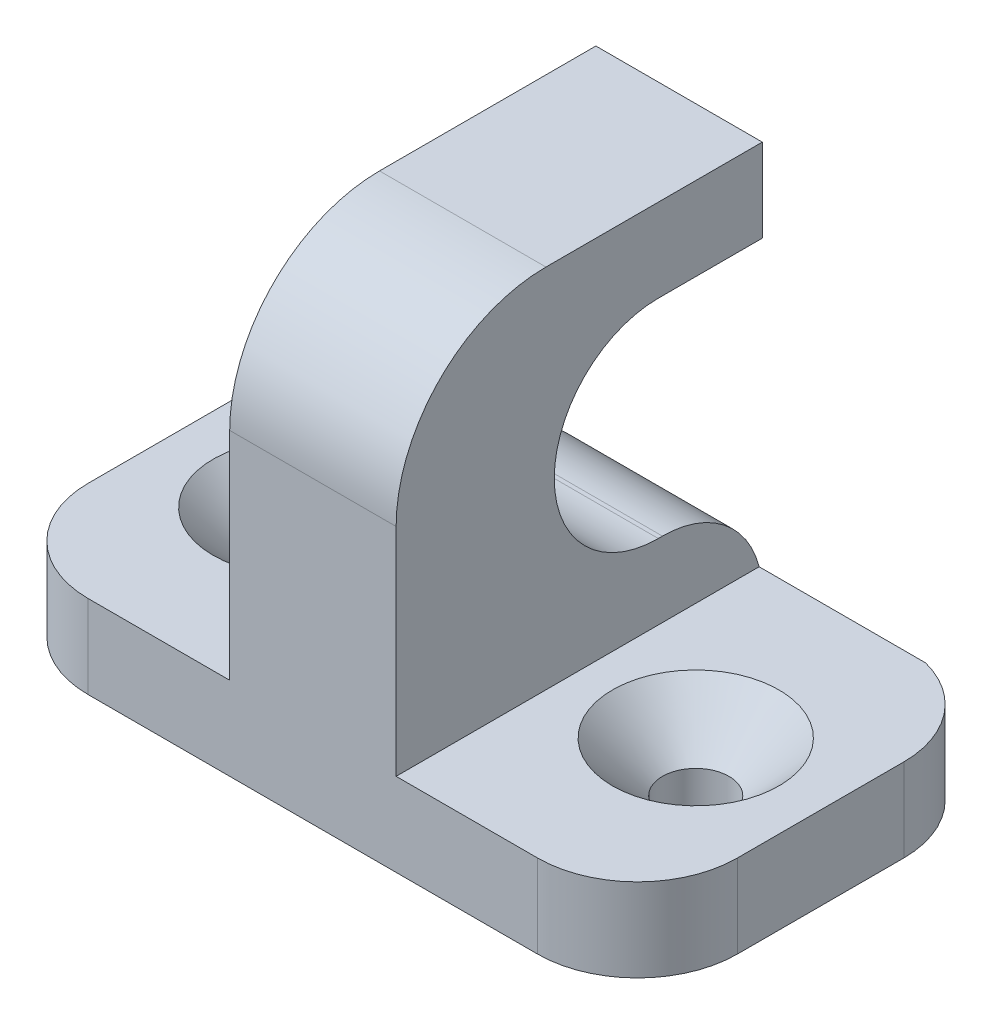
ISO-10303-21;
HEADER;
FILE_DESCRIPTION(('STEP AP214'),'2;1');
FILE_NAME('part.step','',(''),(''),'','','');
FILE_SCHEMA(('AUTOMOTIVE_DESIGN { 1 0 10303 214 1 1 1 1 }'));
ENDSEC;
DATA;
#1=APPLICATION_CONTEXT('core data for automotive mechanical design processes');
#2=APPLICATION_PROTOCOL_DEFINITION('international standard','automotive_design',2000,#1);
#3=PRODUCT_CONTEXT('',#1,'mechanical');
#4=PRODUCT('Part','Part','',(#3));
#5=PRODUCT_RELATED_PRODUCT_CATEGORY('part','',(#4));
#6=PRODUCT_DEFINITION_FORMATION('','',#4);
#7=PRODUCT_DEFINITION_CONTEXT('part definition',#1,'design');
#8=PRODUCT_DEFINITION('design','',#6,#7);
#9=PRODUCT_DEFINITION_SHAPE('','',#8);
#10=(LENGTH_UNIT() NAMED_UNIT(*) SI_UNIT(.MILLI.,.METRE.));
#11=(NAMED_UNIT(*) PLANE_ANGLE_UNIT() SI_UNIT($,.RADIAN.));
#12=(NAMED_UNIT(*) SI_UNIT($,.STERADIAN.) SOLID_ANGLE_UNIT());
#13=UNCERTAINTY_MEASURE_WITH_UNIT(LENGTH_MEASURE(1.E-05),#10,'distance_accuracy_value','');
#14=(GEOMETRIC_REPRESENTATION_CONTEXT(3) GLOBAL_UNCERTAINTY_ASSIGNED_CONTEXT((#13)) GLOBAL_UNIT_ASSIGNED_CONTEXT((#10,
#11,#12)) REPRESENTATION_CONTEXT('',''));
#15=CARTESIAN_POINT('',(0.,0.,0.));
#16=DIRECTION('',(0.,0.,1.));
#17=DIRECTION('',(1.,0.,0.));
#18=AXIS2_PLACEMENT_3D('',#15,#16,#17);
#19=CARTESIAN_POINT('',(-19.5,5.,-11.));
#20=DIRECTION('',(0.,0.,-1.));
#21=DIRECTION('',(-1.,0.,0.));
#22=AXIS2_PLACEMENT_3D('',#19,#20,#21);
#23=PLANE('',#22);
#24=DIRECTION('',(1.,0.,0.));
#25=VECTOR('',#24,1.);
#26=CARTESIAN_POINT('',(5.,22.,-11.));
#27=LINE('',#26,#25);
#28=CARTESIAN_POINT('',(-5.,22.,-11.));
#29=VERTEX_POINT('',#28);
#30=CARTESIAN_POINT('',(5.,22.,-11.));
#31=VERTEX_POINT('',#30);
#32=EDGE_CURVE('E182',#29,#31,#27,.T.);
#33=ORIENTED_EDGE('',*,*,#32,.F.);
#34=DIRECTION('',(0.,-1.,0.));
#35=VECTOR('',#34,1.);
#36=CARTESIAN_POINT('',(-5.,27.,-11.));
#37=LINE('',#36,#35);
#38=CARTESIAN_POINT('',(-5.,27.,-11.));
#39=VERTEX_POINT('',#38);
#40=EDGE_CURVE('E195',#39,#29,#37,.T.);
#41=ORIENTED_EDGE('',*,*,#40,.F.);
#42=DIRECTION('',(-1.,0.,0.));
#43=VECTOR('',#42,1.);
#44=CARTESIAN_POINT('',(-5.,27.,-11.));
#45=LINE('',#44,#43);
#46=CARTESIAN_POINT('',(5.,27.,-11.));
#47=VERTEX_POINT('',#46);
#48=EDGE_CURVE('E430',#47,#39,#45,.T.);
#49=ORIENTED_EDGE('',*,*,#48,.F.);
#50=DIRECTION('',(0.,-1.,0.));
#51=VECTOR('',#50,1.);
#52=CARTESIAN_POINT('',(5.,27.,-11.));
#53=LINE('',#52,#51);
#54=EDGE_CURVE('E198',#47,#31,#53,.T.);
#55=ORIENTED_EDGE('',*,*,#54,.T.);
#56=EDGE_LOOP('',(#33,#41,#49,#55));
#57=FACE_BOUND('',#56,.T.);
#58=ADVANCED_FACE('F41',(#57),#23,.T.);
#59=CARTESIAN_POINT('',(0.,5.,0.));
#60=DIRECTION('',(0.,1.,0.));
#61=DIRECTION('',(0.,0.,1.));
#62=AXIS2_PLACEMENT_3D('',#59,#60,#61);
#63=PLANE('',#62);
#64=CARTESIAN_POINT('',(12.,5.,0.));
#65=DIRECTION('',(0.,1.,0.));
#66=DIRECTION('',(0.,0.,1.));
#67=AXIS2_PLACEMENT_3D('',#64,#65,#66);
#68=CIRCLE('',#67,5.00000000000001);
#69=CARTESIAN_POINT('',(12.,5.,5.00000000000001));
#70=VERTEX_POINT('',#69);
#71=EDGE_CURVE('E360',#70,#70,#68,.F.);
#72=ORIENTED_EDGE('',*,*,#71,.T.);
#73=EDGE_LOOP('',(#72));
#74=FACE_BOUND('',#73,.T.);
#75=CARTESIAN_POINT('',(13.5,5.,-5.));
#76=DIRECTION('',(0.,1.,0.));
#77=DIRECTION('',(0.,0.,1.));
#78=AXIS2_PLACEMENT_3D('',#75,#76,#77);
#79=CIRCLE('',#78,6.);
#80=CARTESIAN_POINT('',(19.5,5.,-5.));
#81=VERTEX_POINT('',#80);
#82=CARTESIAN_POINT('',(15.,5.,-10.8094750193111));
#83=VERTEX_POINT('',#82);
#84=EDGE_CURVE('E307',#81,#83,#79,.T.);
#85=ORIENTED_EDGE('',*,*,#84,.T.);
#86=DIRECTION('',(1.,0.,0.));
#87=VECTOR('',#86,1.);
#88=CARTESIAN_POINT('',(15.,5.,-10.8094750193111));
#89=LINE('',#88,#87);
#90=CARTESIAN_POINT('',(5.,5.,-10.8094750193111));
#91=VERTEX_POINT('',#90);
#92=EDGE_CURVE('E58',#83,#91,#89,.F.);
#93=ORIENTED_EDGE('',*,*,#92,.T.);
#94=DIRECTION('',(0.,0.,-1.));
#95=VECTOR('',#94,1.);
#96=CARTESIAN_POINT('',(5.,5.,-11.));
#97=LINE('',#96,#95);
#98=CARTESIAN_POINT('',(5.,5.,11.));
#99=VERTEX_POINT('',#98);
#100=EDGE_CURVE('E417',#99,#91,#97,.T.);
#101=ORIENTED_EDGE('',*,*,#100,.F.);
#102=DIRECTION('',(1.,0.,0.));
#103=VECTOR('',#102,1.);
#104=CARTESIAN_POINT('',(-19.5,5.,11.));
#105=LINE('',#104,#103);
#106=CARTESIAN_POINT('',(13.5,5.,11.));
#107=VERTEX_POINT('',#106);
#108=EDGE_CURVE('E223',#99,#107,#105,.T.);
#109=ORIENTED_EDGE('',*,*,#108,.T.);
#110=CARTESIAN_POINT('',(13.5,5.,5.));
#111=DIRECTION('',(0.,1.,0.));
#112=DIRECTION('',(0.,0.,1.));
#113=AXIS2_PLACEMENT_3D('',#110,#111,#112);
#114=CIRCLE('',#113,6.);
#115=CARTESIAN_POINT('',(19.5,5.,5.));
#116=VERTEX_POINT('',#115);
#117=EDGE_CURVE('E310',#107,#116,#114,.T.);
#118=ORIENTED_EDGE('',*,*,#117,.T.);
#119=DIRECTION('',(0.,0.,1.));
#120=VECTOR('',#119,1.);
#121=CARTESIAN_POINT('',(19.5,5.,-11.));
#122=LINE('',#121,#120);
#123=EDGE_CURVE('E229',#81,#116,#122,.T.);
#124=ORIENTED_EDGE('',*,*,#123,.F.);
#125=EDGE_LOOP('',(#85,#93,#101,#109,#118,#124));
#126=FACE_BOUND('',#125,.T.);
#127=ADVANCED_FACE('F380',(#74,#126),#63,.T.);
#128=CARTESIAN_POINT('',(-19.5,5.,-11.));
#129=DIRECTION('',(1.,0.,0.));
#130=DIRECTION('',(0.,0.,-1.));
#131=AXIS2_PLACEMENT_3D('',#128,#129,#130);
#132=PLANE('',#131);
#133=DIRECTION('',(0.,0.,1.));
#134=VECTOR('',#133,1.);
#135=CARTESIAN_POINT('',(-19.5,0.,-11.));
#136=LINE('',#135,#134);
#137=CARTESIAN_POINT('',(-19.5,0.,-5.));
#138=VERTEX_POINT('',#137);
#139=CARTESIAN_POINT('',(-19.5,0.,5.));
#140=VERTEX_POINT('',#139);
#141=EDGE_CURVE('E212',#138,#140,#136,.T.);
#142=ORIENTED_EDGE('',*,*,#141,.T.);
#143=DIRECTION('',(0.,-1.,0.));
#144=VECTOR('',#143,1.);
#145=CARTESIAN_POINT('',(-19.5,5.,5.));
#146=LINE('',#145,#144);
#147=CARTESIAN_POINT('',(-19.5,5.,5.));
#148=VERTEX_POINT('',#147);
#149=EDGE_CURVE('E291',#140,#148,#146,.F.);
#150=ORIENTED_EDGE('',*,*,#149,.T.);
#151=DIRECTION('',(0.,0.,1.));
#152=VECTOR('',#151,1.);
#153=CARTESIAN_POINT('',(-19.5,5.,-11.));
#154=LINE('',#153,#152);
#155=CARTESIAN_POINT('',(-19.5,5.,-5.));
#156=VERTEX_POINT('',#155);
#157=EDGE_CURVE('E219',#156,#148,#154,.T.);
#158=ORIENTED_EDGE('',*,*,#157,.F.);
#159=DIRECTION('',(0.,-1.,0.));
#160=VECTOR('',#159,1.);
#161=CARTESIAN_POINT('',(-19.5,0.,-5.));
#162=LINE('',#161,#160);
#163=EDGE_CURVE('E287',#156,#138,#162,.T.);
#164=ORIENTED_EDGE('',*,*,#163,.T.);
#165=EDGE_LOOP('',(#142,#150,#158,#164));
#166=FACE_BOUND('',#165,.T.);
#167=ADVANCED_FACE('F386',(#166),#132,.F.);
#168=CARTESIAN_POINT('',(-19.5,5.,11.));
#169=DIRECTION('',(0.,0.,-1.));
#170=DIRECTION('',(-1.,0.,0.));
#171=AXIS2_PLACEMENT_3D('',#168,#169,#170);
#172=PLANE('',#171);
#173=DIRECTION('',(0.,-1.,0.));
#174=VECTOR('',#173,1.);
#175=CARTESIAN_POINT('',(5.,27.,11.));
#176=LINE('',#175,#174);
#177=CARTESIAN_POINT('',(5.,18.,11.));
#178=VERTEX_POINT('',#177);
#179=EDGE_CURVE('E215',#178,#99,#176,.T.);
#180=ORIENTED_EDGE('',*,*,#179,.F.);
#181=DIRECTION('',(1.,0.,0.));
#182=VECTOR('',#181,1.);
#183=CARTESIAN_POINT('',(-5.,18.,11.));
#184=LINE('',#183,#182);
#185=CARTESIAN_POINT('',(-5.,18.,11.));
#186=VERTEX_POINT('',#185);
#187=EDGE_CURVE('E327',#178,#186,#184,.F.);
#188=ORIENTED_EDGE('',*,*,#187,.T.);
#189=DIRECTION('',(0.,-1.,0.));
#190=VECTOR('',#189,1.);
#191=CARTESIAN_POINT('',(-5.,27.,11.));
#192=LINE('',#191,#190);
#193=CARTESIAN_POINT('',(-5.,5.,11.));
#194=VERTEX_POINT('',#193);
#195=EDGE_CURVE('E208',#186,#194,#192,.T.);
#196=ORIENTED_EDGE('',*,*,#195,.T.);
#197=CARTESIAN_POINT('',(-13.5,5.,11.));
#198=VERTEX_POINT('',#197);
#199=EDGE_CURVE('E225',#198,#194,#105,.T.);
#200=ORIENTED_EDGE('',*,*,#199,.F.);
#201=DIRECTION('',(0.,-1.,0.));
#202=VECTOR('',#201,1.);
#203=CARTESIAN_POINT('',(-13.5,5.,11.));
#204=LINE('',#203,#202);
#205=CARTESIAN_POINT('',(-13.5,0.,11.));
#206=VERTEX_POINT('',#205);
#207=EDGE_CURVE('E271',#198,#206,#204,.T.);
#208=ORIENTED_EDGE('',*,*,#207,.T.);
#209=DIRECTION('',(1.,0.,0.));
#210=VECTOR('',#209,1.);
#211=CARTESIAN_POINT('',(-19.5,0.,11.));
#212=LINE('',#211,#210);
#213=CARTESIAN_POINT('',(13.5,0.,11.));
#214=VERTEX_POINT('',#213);
#215=EDGE_CURVE('E236',#206,#214,#212,.T.);
#216=ORIENTED_EDGE('',*,*,#215,.T.);
#217=DIRECTION('',(0.,-1.,0.));
#218=VECTOR('',#217,1.);
#219=CARTESIAN_POINT('',(13.5,5.,11.));
#220=LINE('',#219,#218);
#221=EDGE_CURVE('E264',#214,#107,#220,.F.);
#222=ORIENTED_EDGE('',*,*,#221,.T.);
#223=ORIENTED_EDGE('',*,*,#108,.F.);
#224=EDGE_LOOP('',(#180,#188,#196,#200,#208,#216,#222,#223));
#225=FACE_BOUND('',#224,.T.);
#226=ADVANCED_FACE('F401',(#225),#172,.F.);
#227=CARTESIAN_POINT('',(19.5,5.,-11.));
#228=DIRECTION('',(1.,0.,0.));
#229=DIRECTION('',(0.,0.,-1.));
#230=AXIS2_PLACEMENT_3D('',#227,#228,#229);
#231=PLANE('',#230);
#232=ORIENTED_EDGE('',*,*,#123,.T.);
#233=DIRECTION('',(0.,-1.,0.));
#234=VECTOR('',#233,1.);
#235=CARTESIAN_POINT('',(19.5,0.,5.));
#236=LINE('',#235,#234);
#237=CARTESIAN_POINT('',(19.5,0.,5.));
#238=VERTEX_POINT('',#237);
#239=EDGE_CURVE('E303',#116,#238,#236,.T.);
#240=ORIENTED_EDGE('',*,*,#239,.T.);
#241=DIRECTION('',(0.,0.,1.));
#242=VECTOR('',#241,1.);
#243=CARTESIAN_POINT('',(19.5,0.,-11.));
#244=LINE('',#243,#242);
#245=CARTESIAN_POINT('',(19.5,0.,-5.));
#246=VERTEX_POINT('',#245);
#247=EDGE_CURVE('E240',#246,#238,#244,.T.);
#248=ORIENTED_EDGE('',*,*,#247,.F.);
#249=DIRECTION('',(0.,-1.,0.));
#250=VECTOR('',#249,1.);
#251=CARTESIAN_POINT('',(19.5,5.,-5.));
#252=LINE('',#251,#250);
#253=EDGE_CURVE('E300',#246,#81,#252,.F.);
#254=ORIENTED_EDGE('',*,*,#253,.T.);
#255=EDGE_LOOP('',(#232,#240,#248,#254));
#256=FACE_BOUND('',#255,.T.);
#257=ADVANCED_FACE('F393',(#256),#231,.T.);
#258=DIRECTION('',(0.,-1.,0.));
#259=VECTOR('',#258,1.);
#260=CARTESIAN_POINT('',(-13.5,5.,-11.));
#261=LINE('',#260,#259);
#262=CARTESIAN_POINT('',(-13.5,0.,-11.));
#263=VERTEX_POINT('',#262);
#264=CARTESIAN_POINT('',(-13.5,3.5,-11.));
#265=VERTEX_POINT('',#264);
#266=EDGE_CURVE('E313',#263,#265,#261,.F.);
#267=ORIENTED_EDGE('',*,*,#266,.T.);
#268=DIRECTION('',(-1.,0.,0.));
#269=VECTOR('',#268,1.);
#270=CARTESIAN_POINT('',(5.,3.5,-11.));
#271=LINE('',#270,#269);
#272=CARTESIAN_POINT('',(13.5,3.5,-11.));
#273=VERTEX_POINT('',#272);
#274=EDGE_CURVE('E346',#265,#273,#271,.F.);
#275=ORIENTED_EDGE('',*,*,#274,.T.);
#276=DIRECTION('',(0.,-1.,0.));
#277=VECTOR('',#276,1.);
#278=CARTESIAN_POINT('',(13.5,5.,-11.));
#279=LINE('',#278,#277);
#280=CARTESIAN_POINT('',(13.5,0.,-11.));
#281=VERTEX_POINT('',#280);
#282=EDGE_CURVE('E317',#273,#281,#279,.T.);
#283=ORIENTED_EDGE('',*,*,#282,.T.);
#284=DIRECTION('',(1.,0.,0.));
#285=VECTOR('',#284,1.);
#286=CARTESIAN_POINT('',(-19.5,0.,-11.));
#287=LINE('',#286,#285);
#288=EDGE_CURVE('E224',#263,#281,#287,.T.);
#289=ORIENTED_EDGE('',*,*,#288,.F.);
#290=EDGE_LOOP('',(#267,#275,#283,#289));
#291=FACE_BOUND('',#290,.T.);
#292=ADVANCED_FACE('F382',(#291),#23,.T.);
#293=CARTESIAN_POINT('',(-12.,5.,0.));
#294=DIRECTION('',(0.,1.,0.));
#295=DIRECTION('',(0.,0.,1.));
#296=AXIS2_PLACEMENT_3D('',#293,#294,#295);
#297=CIRCLE('',#296,5.00000000000001);
#298=CARTESIAN_POINT('',(-12.,5.,5.00000000000001));
#299=VERTEX_POINT('',#298);
#300=EDGE_CURVE('E11',#299,#299,#297,.F.);
#301=ORIENTED_EDGE('',*,*,#300,.T.);
#302=EDGE_LOOP('',(#301));
#303=FACE_BOUND('',#302,.T.);
#304=DIRECTION('',(0.,0.,1.));
#305=VECTOR('',#304,1.);
#306=CARTESIAN_POINT('',(-5.,5.,-11.));
#307=LINE('',#306,#305);
#308=CARTESIAN_POINT('',(-5.,5.,-10.8094750193111));
#309=VERTEX_POINT('',#308);
#310=EDGE_CURVE('E431',#309,#194,#307,.T.);
#311=ORIENTED_EDGE('',*,*,#310,.F.);
#312=DIRECTION('',(1.,0.,0.));
#313=VECTOR('',#312,1.);
#314=CARTESIAN_POINT('',(-5.,5.,-10.8094750193111));
#315=LINE('',#314,#313);
#316=CARTESIAN_POINT('',(-15.,5.,-10.8094750193111));
#317=VERTEX_POINT('',#316);
#318=EDGE_CURVE('E340',#309,#317,#315,.F.);
#319=ORIENTED_EDGE('',*,*,#318,.T.);
#320=CARTESIAN_POINT('',(-13.5,5.,-5.));
#321=DIRECTION('',(0.,1.,0.));
#322=DIRECTION('',(0.,0.,1.));
#323=AXIS2_PLACEMENT_3D('',#320,#321,#322);
#324=CIRCLE('',#323,6.);
#325=EDGE_CURVE('E294',#317,#156,#324,.T.);
#326=ORIENTED_EDGE('',*,*,#325,.T.);
#327=ORIENTED_EDGE('',*,*,#157,.T.);
#328=CARTESIAN_POINT('',(-13.5,5.,5.));
#329=DIRECTION('',(0.,1.,0.));
#330=DIRECTION('',(0.,0.,1.));
#331=AXIS2_PLACEMENT_3D('',#328,#329,#330);
#332=CIRCLE('',#331,6.);
#333=EDGE_CURVE('E297',#148,#198,#332,.T.);
#334=ORIENTED_EDGE('',*,*,#333,.T.);
#335=ORIENTED_EDGE('',*,*,#199,.T.);
#336=EDGE_LOOP('',(#311,#319,#326,#327,#334,#335));
#337=FACE_BOUND('',#336,.T.);
#338=ADVANCED_FACE('F389',(#303,#337),#63,.T.);
#339=CARTESIAN_POINT('',(0.,0.,0.));
#340=DIRECTION('',(0.,1.,0.));
#341=DIRECTION('',(0.,0.,1.));
#342=AXIS2_PLACEMENT_3D('',#339,#340,#341);
#343=PLANE('',#342);
#344=CARTESIAN_POINT('',(-12.,0.,0.));
#345=DIRECTION('',(0.,1.,0.));
#346=DIRECTION('',(0.,0.,1.));
#347=AXIS2_PLACEMENT_3D('',#344,#345,#346);
#348=CIRCLE('',#347,2.);
#349=CARTESIAN_POINT('',(-12.,0.,2.));
#350=VERTEX_POINT('',#349);
#351=EDGE_CURVE('E268',#350,#350,#348,.T.);
#352=ORIENTED_EDGE('',*,*,#351,.T.);
#353=EDGE_LOOP('',(#352));
#354=FACE_BOUND('',#353,.T.);
#355=CARTESIAN_POINT('',(12.,0.,0.));
#356=DIRECTION('',(0.,1.,0.));
#357=DIRECTION('',(0.,0.,1.));
#358=AXIS2_PLACEMENT_3D('',#355,#356,#357);
#359=CIRCLE('',#358,2.);
#360=CARTESIAN_POINT('',(12.,0.,2.));
#361=VERTEX_POINT('',#360);
#362=EDGE_CURVE('E541',#361,#361,#359,.T.);
#363=ORIENTED_EDGE('',*,*,#362,.T.);
#364=EDGE_LOOP('',(#363));
#365=FACE_BOUND('',#364,.T.);
#366=ORIENTED_EDGE('',*,*,#215,.F.);
#367=CARTESIAN_POINT('',(-13.5,0.,5.));
#368=DIRECTION('',(0.,1.,0.));
#369=DIRECTION('',(0.,0.,1.));
#370=AXIS2_PLACEMENT_3D('',#367,#368,#369);
#371=CIRCLE('',#370,6.);
#372=EDGE_CURVE('E284',#206,#140,#371,.F.);
#373=ORIENTED_EDGE('',*,*,#372,.T.);
#374=ORIENTED_EDGE('',*,*,#141,.F.);
#375=CARTESIAN_POINT('',(-13.5,0.,-5.));
#376=DIRECTION('',(0.,1.,0.));
#377=DIRECTION('',(0.,0.,1.));
#378=AXIS2_PLACEMENT_3D('',#375,#376,#377);
#379=CIRCLE('',#378,6.);
#380=EDGE_CURVE('E275',#138,#263,#379,.F.);
#381=ORIENTED_EDGE('',*,*,#380,.T.);
#382=ORIENTED_EDGE('',*,*,#288,.T.);
#383=CARTESIAN_POINT('',(13.5,0.,-5.));
#384=DIRECTION('',(0.,1.,0.));
#385=DIRECTION('',(0.,0.,1.));
#386=AXIS2_PLACEMENT_3D('',#383,#384,#385);
#387=CIRCLE('',#386,6.);
#388=EDGE_CURVE('E278',#281,#246,#387,.F.);
#389=ORIENTED_EDGE('',*,*,#388,.T.);
#390=ORIENTED_EDGE('',*,*,#247,.T.);
#391=CARTESIAN_POINT('',(13.5,0.,5.));
#392=DIRECTION('',(0.,1.,0.));
#393=DIRECTION('',(0.,0.,1.));
#394=AXIS2_PLACEMENT_3D('',#391,#392,#393);
#395=CIRCLE('',#394,6.);
#396=EDGE_CURVE('E281',#238,#214,#395,.F.);
#397=ORIENTED_EDGE('',*,*,#396,.T.);
#398=EDGE_LOOP('',(#366,#373,#374,#381,#382,#389,#390,#397));
#399=FACE_BOUND('',#398,.T.);
#400=ADVANCED_FACE('F399',(#354,#365,#399),#343,.F.);
#401=CARTESIAN_POINT('',(5.,27.,-11.));
#402=DIRECTION('',(-1.,0.,0.));
#403=DIRECTION('',(0.,0.,1.));
#404=AXIS2_PLACEMENT_3D('',#401,#402,#403);
#405=PLANE('',#404);
#406=ORIENTED_EDGE('',*,*,#100,.T.);
#407=CARTESIAN_POINT('',(5.,3.5,-5.));
#408=DIRECTION('',(-1.,0.,0.));
#409=DIRECTION('',(0.,0.,1.));
#410=AXIS2_PLACEMENT_3D('',#407,#408,#409);
#411=CIRCLE('',#410,6.);
#412=CARTESIAN_POINT('',(5.,9.5,-5.));
#413=VERTEX_POINT('',#412);
#414=EDGE_CURVE('E353',#91,#413,#411,.F.);
#415=ORIENTED_EDGE('',*,*,#414,.T.);
#416=DIRECTION('',(0.,0.,-1.));
#417=VECTOR('',#416,1.);
#418=CARTESIAN_POINT('',(5.,9.5,1.5));
#419=LINE('',#418,#417);
#420=CARTESIAN_POINT('',(5.,9.5,-4.75));
#421=VERTEX_POINT('',#420);
#422=EDGE_CURVE('E200',#421,#413,#419,.T.);
#423=ORIENTED_EDGE('',*,*,#422,.F.);
#424=CARTESIAN_POINT('',(5.,15.75,-4.75));
#425=DIRECTION('',(-1.,0.,0.));
#426=DIRECTION('',(0.,0.,1.));
#427=AXIS2_PLACEMENT_3D('',#424,#425,#426);
#428=CIRCLE('',#427,6.25);
#429=CARTESIAN_POINT('',(5.,15.75,1.5));
#430=VERTEX_POINT('',#429);
#431=EDGE_CURVE('E261',#421,#430,#428,.T.);
#432=ORIENTED_EDGE('',*,*,#431,.T.);
#433=CARTESIAN_POINT('',(5.,15.75,-4.75));
#434=DIRECTION('',(-1.,0.,0.));
#435=DIRECTION('',(0.,0.,1.));
#436=AXIS2_PLACEMENT_3D('',#433,#434,#435);
#437=CIRCLE('',#436,6.25);
#438=CARTESIAN_POINT('',(5.,22.,-4.75));
#439=VERTEX_POINT('',#438);
#440=EDGE_CURVE('E252',#430,#439,#437,.T.);
#441=ORIENTED_EDGE('',*,*,#440,.T.);
#442=DIRECTION('',(0.,0.,-1.));
#443=VECTOR('',#442,1.);
#444=CARTESIAN_POINT('',(5.,22.,1.5));
#445=LINE('',#444,#443);
#446=EDGE_CURVE('E189',#439,#31,#445,.T.);
#447=ORIENTED_EDGE('',*,*,#446,.T.);
#448=ORIENTED_EDGE('',*,*,#54,.F.);
#449=DIRECTION('',(0.,0.,-1.));
#450=VECTOR('',#449,1.);
#451=CARTESIAN_POINT('',(5.,27.,-11.));
#452=LINE('',#451,#450);
#453=CARTESIAN_POINT('',(5.,27.,2.));
#454=VERTEX_POINT('',#453);
#455=EDGE_CURVE('E427',#454,#47,#452,.T.);
#456=ORIENTED_EDGE('',*,*,#455,.F.);
#457=CARTESIAN_POINT('',(5.,18.,2.));
#458=DIRECTION('',(-1.,0.,0.));
#459=DIRECTION('',(0.,0.,1.));
#460=AXIS2_PLACEMENT_3D('',#457,#458,#459);
#461=CIRCLE('',#460,9.);
#462=EDGE_CURVE('E324',#454,#178,#461,.F.);
#463=ORIENTED_EDGE('',*,*,#462,.T.);
#464=ORIENTED_EDGE('',*,*,#179,.T.);
#465=EDGE_LOOP('',(#406,#415,#423,#432,#441,#447,#448,#456,#463,#464));
#466=FACE_BOUND('',#465,.T.);
#467=ADVANCED_FACE('F415',(#466),#405,.F.);
#468=CARTESIAN_POINT('',(-5.,27.,-11.));
#469=DIRECTION('',(1.,0.,0.));
#470=DIRECTION('',(0.,0.,-1.));
#471=AXIS2_PLACEMENT_3D('',#468,#469,#470);
#472=PLANE('',#471);
#473=DIRECTION('',(0.,0.,-1.));
#474=VECTOR('',#473,1.);
#475=CARTESIAN_POINT('',(-5.,9.5,1.5));
#476=LINE('',#475,#474);
#477=CARTESIAN_POINT('',(-5.,9.5,-4.75));
#478=VERTEX_POINT('',#477);
#479=CARTESIAN_POINT('',(-5.,9.5,-5.));
#480=VERTEX_POINT('',#479);
#481=EDGE_CURVE('E190',#478,#480,#476,.T.);
#482=ORIENTED_EDGE('',*,*,#481,.T.);
#483=CARTESIAN_POINT('',(-5.,3.5,-5.));
#484=DIRECTION('',(1.,0.,0.));
#485=DIRECTION('',(0.,0.,-1.));
#486=AXIS2_PLACEMENT_3D('',#483,#484,#485);
#487=CIRCLE('',#486,6.);
#488=EDGE_CURVE('E337',#480,#309,#487,.F.);
#489=ORIENTED_EDGE('',*,*,#488,.T.);
#490=ORIENTED_EDGE('',*,*,#310,.T.);
#491=ORIENTED_EDGE('',*,*,#195,.F.);
#492=CARTESIAN_POINT('',(-5.,18.,2.));
#493=DIRECTION('',(1.,0.,0.));
#494=DIRECTION('',(0.,0.,-1.));
#495=AXIS2_PLACEMENT_3D('',#492,#493,#494);
#496=CIRCLE('',#495,9.);
#497=CARTESIAN_POINT('',(-5.,27.,2.));
#498=VERTEX_POINT('',#497);
#499=EDGE_CURVE('E330',#186,#498,#496,.F.);
#500=ORIENTED_EDGE('',*,*,#499,.T.);
#501=DIRECTION('',(0.,0.,1.));
#502=VECTOR('',#501,1.);
#503=CARTESIAN_POINT('',(-5.,27.,-11.));
#504=LINE('',#503,#502);
#505=EDGE_CURVE('E206',#39,#498,#504,.T.);
#506=ORIENTED_EDGE('',*,*,#505,.F.);
#507=ORIENTED_EDGE('',*,*,#40,.T.);
#508=DIRECTION('',(0.,0.,-1.));
#509=VECTOR('',#508,1.);
#510=CARTESIAN_POINT('',(-5.,22.,1.5));
#511=LINE('',#510,#509);
#512=CARTESIAN_POINT('',(-5.,22.,-4.75));
#513=VERTEX_POINT('',#512);
#514=EDGE_CURVE('E178',#513,#29,#511,.T.);
#515=ORIENTED_EDGE('',*,*,#514,.F.);
#516=CARTESIAN_POINT('',(-5.,15.75,-4.75));
#517=DIRECTION('',(1.,0.,0.));
#518=DIRECTION('',(0.,0.,-1.));
#519=AXIS2_PLACEMENT_3D('',#516,#517,#518);
#520=CIRCLE('',#519,6.25);
#521=CARTESIAN_POINT('',(-5.,15.75,1.5));
#522=VERTEX_POINT('',#521);
#523=EDGE_CURVE('E255',#513,#522,#520,.T.);
#524=ORIENTED_EDGE('',*,*,#523,.T.);
#525=CARTESIAN_POINT('',(-5.,15.75,-4.75));
#526=DIRECTION('',(1.,0.,0.));
#527=DIRECTION('',(0.,0.,-1.));
#528=AXIS2_PLACEMENT_3D('',#525,#526,#527);
#529=CIRCLE('',#528,6.25);
#530=EDGE_CURVE('E258',#522,#478,#529,.T.);
#531=ORIENTED_EDGE('',*,*,#530,.T.);
#532=EDGE_LOOP('',(#482,#489,#490,#491,#500,#506,#507,#515,#524,#531));
#533=FACE_BOUND('',#532,.T.);
#534=ADVANCED_FACE('F204',(#533),#472,.F.);
#535=CARTESIAN_POINT('',(0.,27.,0.));
#536=DIRECTION('',(0.,1.,0.));
#537=DIRECTION('',(0.,0.,1.));
#538=AXIS2_PLACEMENT_3D('',#535,#536,#537);
#539=PLANE('',#538);
#540=ORIENTED_EDGE('',*,*,#505,.T.);
#541=DIRECTION('',(1.,0.,0.));
#542=VECTOR('',#541,1.);
#543=CARTESIAN_POINT('',(5.,27.,2.));
#544=LINE('',#543,#542);
#545=EDGE_CURVE('E320',#498,#454,#544,.T.);
#546=ORIENTED_EDGE('',*,*,#545,.T.);
#547=ORIENTED_EDGE('',*,*,#455,.T.);
#548=ORIENTED_EDGE('',*,*,#48,.T.);
#549=EDGE_LOOP('',(#540,#546,#547,#548));
#550=FACE_BOUND('',#549,.T.);
#551=ADVANCED_FACE('F523',(#550),#539,.T.);
#552=CARTESIAN_POINT('',(5.,22.,1.5));
#553=DIRECTION('',(0.,1.,0.));
#554=DIRECTION('',(0.,0.,1.));
#555=AXIS2_PLACEMENT_3D('',#552,#553,#554);
#556=PLANE('',#555);
#557=ORIENTED_EDGE('',*,*,#446,.F.);
#558=DIRECTION('',(1.,0.,0.));
#559=VECTOR('',#558,1.);
#560=CARTESIAN_POINT('',(5.,22.,-4.75));
#561=LINE('',#560,#559);
#562=EDGE_CURVE('E185',#439,#513,#561,.F.);
#563=ORIENTED_EDGE('',*,*,#562,.T.);
#564=ORIENTED_EDGE('',*,*,#514,.T.);
#565=ORIENTED_EDGE('',*,*,#32,.T.);
#566=EDGE_LOOP('',(#557,#563,#564,#565));
#567=FACE_BOUND('',#566,.T.);
#568=ADVANCED_FACE('F181',(#567),#556,.F.);
#569=CARTESIAN_POINT('',(5.,9.5,1.5));
#570=DIRECTION('',(0.,-1.,0.));
#571=DIRECTION('',(0.,0.,-1.));
#572=AXIS2_PLACEMENT_3D('',#569,#570,#571);
#573=PLANE('',#572);
#574=ORIENTED_EDGE('',*,*,#422,.T.);
#575=DIRECTION('',(-1.,0.,0.));
#576=VECTOR('',#575,1.);
#577=CARTESIAN_POINT('',(-5.,9.5,-5.));
#578=LINE('',#577,#576);
#579=EDGE_CURVE('E333',#413,#480,#578,.T.);
#580=ORIENTED_EDGE('',*,*,#579,.T.);
#581=ORIENTED_EDGE('',*,*,#481,.F.);
#582=DIRECTION('',(-1.,0.,0.));
#583=VECTOR('',#582,1.);
#584=CARTESIAN_POINT('',(5.,9.5,-4.75));
#585=LINE('',#584,#583);
#586=EDGE_CURVE('E249',#478,#421,#585,.F.);
#587=ORIENTED_EDGE('',*,*,#586,.T.);
#588=EDGE_LOOP('',(#574,#580,#581,#587));
#589=FACE_BOUND('',#588,.T.);
#590=ADVANCED_FACE('F419',(#589),#573,.F.);
#591=CARTESIAN_POINT('',(0.,15.75,-4.75));
#592=DIRECTION('',(-1.,0.,0.));
#593=DIRECTION('',(0.,0.,1.));
#594=AXIS2_PLACEMENT_3D('',#591,#592,#593);
#595=CYLINDRICAL_SURFACE('',#594,6.25);
#596=ORIENTED_EDGE('',*,*,#586,.F.);
#597=ORIENTED_EDGE('',*,*,#530,.F.);
#598=DIRECTION('',(-1.,0.,0.));
#599=VECTOR('',#598,1.);
#600=CARTESIAN_POINT('',(0.,15.75,1.5));
#601=LINE('',#600,#599);
#602=EDGE_CURVE('E201',#430,#522,#601,.T.);
#603=ORIENTED_EDGE('',*,*,#602,.F.);
#604=ORIENTED_EDGE('',*,*,#431,.F.);
#605=EDGE_LOOP('',(#596,#597,#603,#604));
#606=FACE_BOUND('',#605,.T.);
#607=ADVANCED_FACE('F476',(#606),#595,.F.);
#608=CARTESIAN_POINT('',(0.,15.75,-4.75));
#609=DIRECTION('',(1.,0.,0.));
#610=DIRECTION('',(0.,0.,-1.));
#611=AXIS2_PLACEMENT_3D('',#608,#609,#610);
#612=CYLINDRICAL_SURFACE('',#611,6.25);
#613=ORIENTED_EDGE('',*,*,#523,.F.);
#614=ORIENTED_EDGE('',*,*,#562,.F.);
#615=ORIENTED_EDGE('',*,*,#440,.F.);
#616=ORIENTED_EDGE('',*,*,#602,.T.);
#617=EDGE_LOOP('',(#613,#614,#615,#616));
#618=FACE_BOUND('',#617,.T.);
#619=ADVANCED_FACE('F482',(#618),#612,.F.);
#620=CARTESIAN_POINT('',(-13.5,5.,5.));
#621=DIRECTION('',(0.,-1.,0.));
#622=DIRECTION('',(0.,0.,-1.));
#623=AXIS2_PLACEMENT_3D('',#620,#621,#622);
#624=CYLINDRICAL_SURFACE('',#623,6.);
#625=ORIENTED_EDGE('',*,*,#333,.F.);
#626=ORIENTED_EDGE('',*,*,#149,.F.);
#627=ORIENTED_EDGE('',*,*,#372,.F.);
#628=ORIENTED_EDGE('',*,*,#207,.F.);
#629=EDGE_LOOP('',(#625,#626,#627,#628));
#630=FACE_BOUND('',#629,.T.);
#631=ADVANCED_FACE('F472',(#630),#624,.T.);
#632=CARTESIAN_POINT('',(13.5,5.,5.));
#633=DIRECTION('',(0.,1.,0.));
#634=DIRECTION('',(0.,0.,1.));
#635=AXIS2_PLACEMENT_3D('',#632,#633,#634);
#636=CYLINDRICAL_SURFACE('',#635,6.);
#637=ORIENTED_EDGE('',*,*,#117,.F.);
#638=ORIENTED_EDGE('',*,*,#221,.F.);
#639=ORIENTED_EDGE('',*,*,#396,.F.);
#640=ORIENTED_EDGE('',*,*,#239,.F.);
#641=EDGE_LOOP('',(#637,#638,#639,#640));
#642=FACE_BOUND('',#641,.T.);
#643=ADVANCED_FACE('F451',(#642),#636,.T.);
#644=CARTESIAN_POINT('',(13.5,5.,-5.));
#645=DIRECTION('',(0.,-1.,0.));
#646=DIRECTION('',(0.,0.,-1.));
#647=AXIS2_PLACEMENT_3D('',#644,#645,#646);
#648=CYLINDRICAL_SURFACE('',#647,6.);
#649=ORIENTED_EDGE('',*,*,#282,.F.);
#650=CARTESIAN_POINT('',(13.5,3.5,-5.));
#651=DIRECTION('',(0.707106781186547,-0.707106781186547,0.));
#652=DIRECTION('',(-0.707106781186547,-0.707106781186547,0.));
#653=AXIS2_PLACEMENT_3D('',#650,#651,#652);
#654=ELLIPSE('',#653,8.48528137423857,6.);
#655=EDGE_CURVE('E66',#273,#83,#654,.T.);
#656=ORIENTED_EDGE('',*,*,#655,.T.);
#657=ORIENTED_EDGE('',*,*,#84,.F.);
#658=ORIENTED_EDGE('',*,*,#253,.F.);
#659=ORIENTED_EDGE('',*,*,#388,.F.);
#660=EDGE_LOOP('',(#649,#656,#657,#658,#659));
#661=FACE_BOUND('',#660,.T.);
#662=ADVANCED_FACE('F457',(#661),#648,.T.);
#663=CARTESIAN_POINT('',(-13.5,5.,-5.));
#664=DIRECTION('',(0.,1.,0.));
#665=DIRECTION('',(0.,0.,1.));
#666=AXIS2_PLACEMENT_3D('',#663,#664,#665);
#667=CYLINDRICAL_SURFACE('',#666,6.);
#668=ORIENTED_EDGE('',*,*,#325,.F.);
#669=CARTESIAN_POINT('',(-13.5,3.5,-5.));
#670=DIRECTION('',(0.707106781186547,0.707106781186547,0.));
#671=DIRECTION('',(-0.707106781186547,0.707106781186547,0.));
#672=AXIS2_PLACEMENT_3D('',#669,#670,#671);
#673=ELLIPSE('',#672,8.48528137423857,6.);
#674=EDGE_CURVE('E343',#317,#265,#673,.F.);
#675=ORIENTED_EDGE('',*,*,#674,.T.);
#676=ORIENTED_EDGE('',*,*,#266,.F.);
#677=ORIENTED_EDGE('',*,*,#380,.F.);
#678=ORIENTED_EDGE('',*,*,#163,.F.);
#679=EDGE_LOOP('',(#668,#675,#676,#677,#678));
#680=FACE_BOUND('',#679,.T.);
#681=ADVANCED_FACE('F462',(#680),#667,.T.);
#682=CARTESIAN_POINT('',(0.,18.,2.));
#683=DIRECTION('',(-1.,0.,0.));
#684=DIRECTION('',(0.,0.,1.));
#685=AXIS2_PLACEMENT_3D('',#682,#683,#684);
#686=CYLINDRICAL_SURFACE('',#685,9.);
#687=ORIENTED_EDGE('',*,*,#499,.F.);
#688=ORIENTED_EDGE('',*,*,#187,.F.);
#689=ORIENTED_EDGE('',*,*,#462,.F.);
#690=ORIENTED_EDGE('',*,*,#545,.F.);
#691=EDGE_LOOP('',(#687,#688,#689,#690));
#692=FACE_BOUND('',#691,.T.);
#693=ADVANCED_FACE('F500',(#692),#686,.T.);
#694=CARTESIAN_POINT('',(12.,0.,0.));
#695=DIRECTION('',(0.,1.,0.));
#696=DIRECTION('',(0.,0.,1.));
#697=AXIS2_PLACEMENT_3D('',#694,#695,#696);
#698=CYLINDRICAL_SURFACE('',#697,2.);
#699=CARTESIAN_POINT('',(12.,2.,0.));
#700=DIRECTION('',(0.,1.,0.));
#701=DIRECTION('',(0.,0.,1.));
#702=AXIS2_PLACEMENT_3D('',#699,#700,#701);
#703=CIRCLE('',#702,2.);
#704=CARTESIAN_POINT('',(12.,2.,2.));
#705=VERTEX_POINT('',#704);
#706=EDGE_CURVE('E356',#705,#705,#703,.T.);
#707=ORIENTED_EDGE('',*,*,#706,.T.);
#708=EDGE_LOOP('',(#707));
#709=FACE_BOUND('',#708,.T.);
#710=ORIENTED_EDGE('',*,*,#362,.F.);
#711=EDGE_LOOP('',(#710));
#712=FACE_BOUND('',#711,.T.);
#713=ADVANCED_FACE('F503',(#709,#712),#698,.F.);
#714=CARTESIAN_POINT('',(-12.,0.,0.));
#715=DIRECTION('',(0.,1.,0.));
#716=DIRECTION('',(0.,0.,1.));
#717=AXIS2_PLACEMENT_3D('',#714,#715,#716);
#718=CYLINDRICAL_SURFACE('',#717,2.);
#719=CARTESIAN_POINT('',(-12.,2.,0.));
#720=DIRECTION('',(0.,1.,0.));
#721=DIRECTION('',(0.,0.,1.));
#722=AXIS2_PLACEMENT_3D('',#719,#720,#721);
#723=CIRCLE('',#722,2.);
#724=CARTESIAN_POINT('',(-12.,2.,2.));
#725=VERTEX_POINT('',#724);
#726=EDGE_CURVE('E51',#725,#725,#723,.T.);
#727=ORIENTED_EDGE('',*,*,#726,.T.);
#728=EDGE_LOOP('',(#727));
#729=FACE_BOUND('',#728,.T.);
#730=ORIENTED_EDGE('',*,*,#351,.F.);
#731=EDGE_LOOP('',(#730));
#732=FACE_BOUND('',#731,.T.);
#733=ADVANCED_FACE('F367',(#729,#732),#718,.F.);
#734=CARTESIAN_POINT('',(5.,3.5,-5.));
#735=DIRECTION('',(1.,0.,0.));
#736=DIRECTION('',(0.,0.,-1.));
#737=AXIS2_PLACEMENT_3D('',#734,#735,#736);
#738=CYLINDRICAL_SURFACE('',#737,6.);
#739=ORIENTED_EDGE('',*,*,#655,.F.);
#740=ORIENTED_EDGE('',*,*,#274,.F.);
#741=ORIENTED_EDGE('',*,*,#674,.F.);
#742=ORIENTED_EDGE('',*,*,#318,.F.);
#743=ORIENTED_EDGE('',*,*,#488,.F.);
#744=ORIENTED_EDGE('',*,*,#579,.F.);
#745=ORIENTED_EDGE('',*,*,#414,.F.);
#746=ORIENTED_EDGE('',*,*,#92,.F.);
#747=EDGE_LOOP('',(#739,#740,#741,#742,#743,#744,#745,#746));
#748=FACE_BOUND('',#747,.T.);
#749=ADVANCED_FACE('F376',(#748),#738,.T.);
#750=CARTESIAN_POINT('',(12.,2.,0.));
#751=DIRECTION('',(0.,1.,0.));
#752=DIRECTION('',(0.,0.,1.));
#753=AXIS2_PLACEMENT_3D('',#750,#751,#752);
#754=CONICAL_SURFACE('',#753,2.,0.785398163397451);
#755=CARTESIAN_POINT('',(12.,5.,5.00000000000001));
#756=CARTESIAN_POINT('',(12.,4.96875,4.96875000000001));
#757=CARTESIAN_POINT('',(12.,4.9375,4.93750000000001));
#758=CARTESIAN_POINT('',(12.,4.875,4.87500000000001));
#759=CARTESIAN_POINT('',(12.,4.84375,4.84375000000001));
#760=CARTESIAN_POINT('',(12.,4.78125,4.78125000000001));
#761=CARTESIAN_POINT('',(12.,4.75,4.75000000000001));
#762=CARTESIAN_POINT('',(12.,4.6875,4.68750000000001));
#763=CARTESIAN_POINT('',(12.,4.65625,4.65625000000001));
#764=CARTESIAN_POINT('',(12.,4.59375,4.59375000000001));
#765=CARTESIAN_POINT('',(12.,4.5625,4.56250000000001));
#766=CARTESIAN_POINT('',(12.,4.5,4.50000000000001));
#767=CARTESIAN_POINT('',(12.,4.46875,4.46875000000001));
#768=CARTESIAN_POINT('',(12.,4.40625,4.40625000000001));
#769=CARTESIAN_POINT('',(12.,4.375,4.37500000000001));
#770=CARTESIAN_POINT('',(12.,4.3125,4.31250000000001));
#771=CARTESIAN_POINT('',(12.,4.28125,4.28125000000001));
#772=CARTESIAN_POINT('',(12.,4.21875,4.21875000000001));
#773=CARTESIAN_POINT('',(12.,4.1875,4.18750000000001));
#774=CARTESIAN_POINT('',(12.,4.125,4.12500000000001));
#775=CARTESIAN_POINT('',(12.,4.09375,4.09375000000001));
#776=CARTESIAN_POINT('',(12.,4.03125,4.03125000000001));
#777=CARTESIAN_POINT('',(12.,4.,4.00000000000001));
#778=CARTESIAN_POINT('',(12.,3.9375,3.93750000000001));
#779=CARTESIAN_POINT('',(12.,3.90625,3.90625000000001));
#780=CARTESIAN_POINT('',(12.,3.84375,3.84375000000001));
#781=CARTESIAN_POINT('',(12.,3.8125,3.81250000000001));
#782=CARTESIAN_POINT('',(12.,3.75,3.75000000000001));
#783=CARTESIAN_POINT('',(12.,3.71875,3.71875000000001));
#784=CARTESIAN_POINT('',(12.,3.65625,3.65625000000001));
#785=CARTESIAN_POINT('',(12.,3.625,3.62500000000001));
#786=CARTESIAN_POINT('',(12.,3.5625,3.56250000000001));
#787=CARTESIAN_POINT('',(12.,3.53125,3.53125000000001));
#788=CARTESIAN_POINT('',(12.,3.46875,3.46875000000001));
#789=CARTESIAN_POINT('',(12.,3.4375,3.43750000000001));
#790=CARTESIAN_POINT('',(12.,3.375,3.37500000000001));
#791=CARTESIAN_POINT('',(12.,3.34375,3.34375000000001));
#792=CARTESIAN_POINT('',(12.,3.28125,3.28125));
#793=CARTESIAN_POINT('',(12.,3.25,3.25));
#794=CARTESIAN_POINT('',(12.,3.1875,3.1875));
#795=CARTESIAN_POINT('',(12.,3.15625,3.15625));
#796=CARTESIAN_POINT('',(12.,3.09375,3.09375));
#797=CARTESIAN_POINT('',(12.,3.0625,3.0625));
#798=CARTESIAN_POINT('',(12.,3.,3.));
#799=CARTESIAN_POINT('',(12.,2.96875,2.96875));
#800=CARTESIAN_POINT('',(12.,2.90625,2.90625));
#801=CARTESIAN_POINT('',(12.,2.875,2.875));
#802=CARTESIAN_POINT('',(12.,2.8125,2.8125));
#803=CARTESIAN_POINT('',(12.,2.78125,2.78125));
#804=CARTESIAN_POINT('',(12.,2.71875,2.71875));
#805=CARTESIAN_POINT('',(12.,2.6875,2.6875));
#806=CARTESIAN_POINT('',(12.,2.625,2.625));
#807=CARTESIAN_POINT('',(12.,2.59375,2.59375));
#808=CARTESIAN_POINT('',(12.,2.53125,2.53125));
#809=CARTESIAN_POINT('',(12.,2.5,2.5));
#810=CARTESIAN_POINT('',(12.,2.4375,2.4375));
#811=CARTESIAN_POINT('',(12.,2.40625,2.40625));
#812=CARTESIAN_POINT('',(12.,2.34375,2.34375));
#813=CARTESIAN_POINT('',(12.,2.3125,2.3125));
#814=CARTESIAN_POINT('',(12.,2.25,2.25));
#815=CARTESIAN_POINT('',(12.,2.21875,2.21875));
#816=CARTESIAN_POINT('',(12.,2.15625,2.15625));
#817=CARTESIAN_POINT('',(12.,2.125,2.125));
#818=CARTESIAN_POINT('',(12.,2.0625,2.0625));
#819=CARTESIAN_POINT('',(12.,2.03125,2.03125));
#820=CARTESIAN_POINT('',(12.,2.,2.));
#821=B_SPLINE_CURVE_WITH_KNOTS('',3,(#755,#756,#757,#758,#759,#760,#761,#762,#763,#764,#765,
#766,#767,#768,#769,#770,#771,#772,#773,#774,#775,#776,#777,#778,#779,#780,#781,#782,#783,#784,
#785,#786,#787,#788,#789,#790,#791,#792,#793,#794,#795,#796,#797,#798,#799,#800,#801,#802,#803,
#804,#805,#806,#807,#808,#809,#810,#811,#812,#813,#814,#815,#816,#817,#818,#819,#820),
.UNSPECIFIED.,.F.,.F.,(4,2,2,2,2,2,2,2,2,2,2,2,2,2,2,2,2,2,2,2,2,2,2,2,2,2,2,2,2,2,2,2,4),(0.,
0.132582521472478,0.265165042944955,0.397747564417433,0.530330085889911,0.662912607362389,
0.795495128834867,0.928077650307345,1.06066017177982,1.1932426932523,1.32582521472478,
1.45840773619726,1.59099025766973,1.72357277914221,1.85615530061469,1.98873782208717,
2.12132034355965,2.25390286503212,2.3864853865046,2.51906790797708,2.65165042944956,
2.78423295092203,2.91681547239451,3.04939799386699,3.18198051533947,3.31456303681195,
3.44714555828442,3.5797280797569,3.71231060122938,3.84489312270186,3.97747564417434,
4.11005816564681,4.24264068711929),.UNSPECIFIED.);
#822=EDGE_CURVE('BSEAM371',#70,#705,#821,.T.);
#823=ORIENTED_EDGE('',*,*,#71,.F.);
#824=ORIENTED_EDGE('',*,*,#706,.F.);
#825=ORIENTED_EDGE('',*,*,#822,.T.);
#826=ORIENTED_EDGE('',*,*,#822,.F.);
#827=EDGE_LOOP('',(#823,#825,#824,#826));
#828=FACE_BOUND('',#827,.T.);
#829=ADVANCED_FACE('F371',(#828),#754,.F.);
#830=CARTESIAN_POINT('',(-12.,2.,0.));
#831=DIRECTION('',(0.,1.,0.));
#832=DIRECTION('',(0.,0.,1.));
#833=AXIS2_PLACEMENT_3D('',#830,#831,#832);
#834=CONICAL_SURFACE('',#833,2.,0.785398163397451);
#835=CARTESIAN_POINT('',(-12.,5.,5.00000000000001));
#836=CARTESIAN_POINT('',(-12.,4.96875,4.96875000000001));
#837=CARTESIAN_POINT('',(-12.,4.9375,4.93750000000001));
#838=CARTESIAN_POINT('',(-12.,4.875,4.87500000000001));
#839=CARTESIAN_POINT('',(-12.,4.84375,4.84375000000001));
#840=CARTESIAN_POINT('',(-12.,4.78125,4.78125000000001));
#841=CARTESIAN_POINT('',(-12.,4.75,4.75000000000001));
#842=CARTESIAN_POINT('',(-12.,4.6875,4.68750000000001));
#843=CARTESIAN_POINT('',(-12.,4.65625,4.65625000000001));
#844=CARTESIAN_POINT('',(-12.,4.59375,4.59375000000001));
#845=CARTESIAN_POINT('',(-12.,4.5625,4.56250000000001));
#846=CARTESIAN_POINT('',(-12.,4.5,4.50000000000001));
#847=CARTESIAN_POINT('',(-12.,4.46875,4.46875000000001));
#848=CARTESIAN_POINT('',(-12.,4.40625,4.40625000000001));
#849=CARTESIAN_POINT('',(-12.,4.375,4.37500000000001));
#850=CARTESIAN_POINT('',(-12.,4.3125,4.31250000000001));
#851=CARTESIAN_POINT('',(-12.,4.28125,4.28125000000001));
#852=CARTESIAN_POINT('',(-12.,4.21875,4.21875000000001));
#853=CARTESIAN_POINT('',(-12.,4.1875,4.18750000000001));
#854=CARTESIAN_POINT('',(-12.,4.125,4.12500000000001));
#855=CARTESIAN_POINT('',(-12.,4.09375,4.09375000000001));
#856=CARTESIAN_POINT('',(-12.,4.03125,4.03125000000001));
#857=CARTESIAN_POINT('',(-12.,4.,4.00000000000001));
#858=CARTESIAN_POINT('',(-12.,3.9375,3.93750000000001));
#859=CARTESIAN_POINT('',(-12.,3.90625,3.90625000000001));
#860=CARTESIAN_POINT('',(-12.,3.84375,3.84375000000001));
#861=CARTESIAN_POINT('',(-12.,3.8125,3.81250000000001));
#862=CARTESIAN_POINT('',(-12.,3.75,3.75000000000001));
#863=CARTESIAN_POINT('',(-12.,3.71875,3.71875000000001));
#864=CARTESIAN_POINT('',(-12.,3.65625,3.65625000000001));
#865=CARTESIAN_POINT('',(-12.,3.625,3.62500000000001));
#866=CARTESIAN_POINT('',(-12.,3.5625,3.56250000000001));
#867=CARTESIAN_POINT('',(-12.,3.53125,3.53125000000001));
#868=CARTESIAN_POINT('',(-12.,3.46875,3.46875000000001));
#869=CARTESIAN_POINT('',(-12.,3.4375,3.43750000000001));
#870=CARTESIAN_POINT('',(-12.,3.375,3.37500000000001));
#871=CARTESIAN_POINT('',(-12.,3.34375,3.34375000000001));
#872=CARTESIAN_POINT('',(-12.,3.28125,3.28125));
#873=CARTESIAN_POINT('',(-12.,3.25,3.25));
#874=CARTESIAN_POINT('',(-12.,3.1875,3.1875));
#875=CARTESIAN_POINT('',(-12.,3.15625,3.15625));
#876=CARTESIAN_POINT('',(-12.,3.09375,3.09375));
#877=CARTESIAN_POINT('',(-12.,3.0625,3.0625));
#878=CARTESIAN_POINT('',(-12.,3.,3.));
#879=CARTESIAN_POINT('',(-12.,2.96875,2.96875));
#880=CARTESIAN_POINT('',(-12.,2.90625,2.90625));
#881=CARTESIAN_POINT('',(-12.,2.875,2.875));
#882=CARTESIAN_POINT('',(-12.,2.8125,2.8125));
#883=CARTESIAN_POINT('',(-12.,2.78125,2.78125));
#884=CARTESIAN_POINT('',(-12.,2.71875,2.71875));
#885=CARTESIAN_POINT('',(-12.,2.6875,2.6875));
#886=CARTESIAN_POINT('',(-12.,2.625,2.625));
#887=CARTESIAN_POINT('',(-12.,2.59375,2.59375));
#888=CARTESIAN_POINT('',(-12.,2.53125,2.53125));
#889=CARTESIAN_POINT('',(-12.,2.5,2.5));
#890=CARTESIAN_POINT('',(-12.,2.4375,2.4375));
#891=CARTESIAN_POINT('',(-12.,2.40625,2.40625));
#892=CARTESIAN_POINT('',(-12.,2.34375,2.34375));
#893=CARTESIAN_POINT('',(-12.,2.3125,2.3125));
#894=CARTESIAN_POINT('',(-12.,2.25,2.25));
#895=CARTESIAN_POINT('',(-12.,2.21875,2.21875));
#896=CARTESIAN_POINT('',(-12.,2.15625,2.15625));
#897=CARTESIAN_POINT('',(-12.,2.125,2.125));
#898=CARTESIAN_POINT('',(-12.,2.0625,2.0625));
#899=CARTESIAN_POINT('',(-12.,2.03125,2.03125));
#900=CARTESIAN_POINT('',(-12.,2.,2.));
#901=B_SPLINE_CURVE_WITH_KNOTS('',3,(#835,#836,#837,#838,#839,#840,#841,#842,#843,#844,#845,
#846,#847,#848,#849,#850,#851,#852,#853,#854,#855,#856,#857,#858,#859,#860,#861,#862,#863,#864,
#865,#866,#867,#868,#869,#870,#871,#872,#873,#874,#875,#876,#877,#878,#879,#880,#881,#882,#883,
#884,#885,#886,#887,#888,#889,#890,#891,#892,#893,#894,#895,#896,#897,#898,#899,#900),
.UNSPECIFIED.,.F.,.F.,(4,2,2,2,2,2,2,2,2,2,2,2,2,2,2,2,2,2,2,2,2,2,2,2,2,2,2,2,2,2,2,2,4),(0.,
0.132582521472478,0.265165042944955,0.397747564417433,0.530330085889911,0.662912607362389,
0.795495128834867,0.928077650307345,1.06066017177982,1.1932426932523,1.32582521472478,
1.45840773619726,1.59099025766973,1.72357277914221,1.85615530061469,1.98873782208717,
2.12132034355965,2.25390286503212,2.3864853865046,2.51906790797708,2.65165042944956,
2.78423295092203,2.91681547239451,3.04939799386699,3.18198051533947,3.31456303681195,
3.44714555828442,3.5797280797569,3.71231060122938,3.84489312270186,3.97747564417434,
4.11005816564681,4.24264068711929),.UNSPECIFIED.);
#902=EDGE_CURVE('BSEAM44',#299,#725,#901,.T.);
#903=ORIENTED_EDGE('',*,*,#300,.F.);
#904=ORIENTED_EDGE('',*,*,#726,.F.);
#905=ORIENTED_EDGE('',*,*,#902,.T.);
#906=ORIENTED_EDGE('',*,*,#902,.F.);
#907=EDGE_LOOP('',(#903,#905,#904,#906));
#908=FACE_BOUND('',#907,.T.);
#909=ADVANCED_FACE('F44',(#908),#834,.F.);
#910=CLOSED_SHELL('',(#58,#127,#167,#226,#257,#292,#338,#400,#467,#534,#551,#568,#590,#607,#619,
#631,#643,#662,#681,#693,#713,#733,#749,#829,#909));
#911=MANIFOLD_SOLID_BREP('B2',#910);
#912=ADVANCED_BREP_SHAPE_REPRESENTATION('',(#18,#911),#14);
#913=SHAPE_DEFINITION_REPRESENTATION(#9,#912);
ENDSEC;
END-ISO-10303-21;
